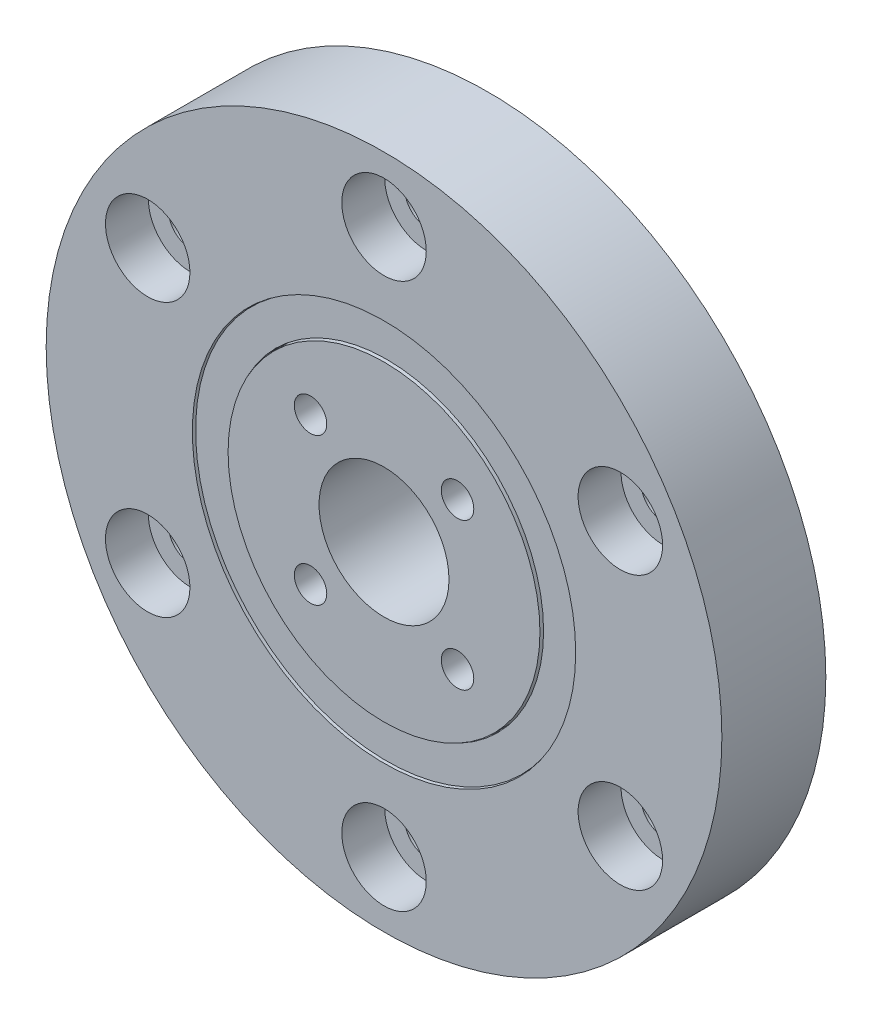
ISO-10303-21;
HEADER;
FILE_DESCRIPTION(('STEP AP214'),'2;1');
FILE_NAME('part.step','',(''),(''),'','','');
FILE_SCHEMA(('AUTOMOTIVE_DESIGN { 1 0 10303 214 1 1 1 1 }'));
ENDSEC;
DATA;
#1=APPLICATION_CONTEXT('core data for automotive mechanical design processes');
#2=APPLICATION_PROTOCOL_DEFINITION('international standard','automotive_design',2000,#1);
#3=PRODUCT_CONTEXT('',#1,'mechanical');
#4=PRODUCT('Part','Part','',(#3));
#5=PRODUCT_RELATED_PRODUCT_CATEGORY('part','',(#4));
#6=PRODUCT_DEFINITION_FORMATION('','',#4);
#7=PRODUCT_DEFINITION_CONTEXT('part definition',#1,'design');
#8=PRODUCT_DEFINITION('design','',#6,#7);
#9=PRODUCT_DEFINITION_SHAPE('','',#8);
#10=(LENGTH_UNIT() NAMED_UNIT(*) SI_UNIT(.MILLI.,.METRE.));
#11=(NAMED_UNIT(*) PLANE_ANGLE_UNIT() SI_UNIT($,.RADIAN.));
#12=(NAMED_UNIT(*) SI_UNIT($,.STERADIAN.) SOLID_ANGLE_UNIT());
#13=UNCERTAINTY_MEASURE_WITH_UNIT(LENGTH_MEASURE(1.E-05),#10,'distance_accuracy_value','');
#14=(GEOMETRIC_REPRESENTATION_CONTEXT(3) GLOBAL_UNCERTAINTY_ASSIGNED_CONTEXT((#13)) GLOBAL_UNIT_ASSIGNED_CONTEXT((#10,
#11,#12)) REPRESENTATION_CONTEXT('',''));
#15=CARTESIAN_POINT('',(0.,0.,0.));
#16=DIRECTION('',(0.,0.,1.));
#17=DIRECTION('',(1.,0.,0.));
#18=AXIS2_PLACEMENT_3D('',#15,#16,#17);
#19=CARTESIAN_POINT('',(0.,0.,0.75));
#20=DIRECTION('',(0.,0.,1.));
#21=DIRECTION('',(1.,0.,0.));
#22=AXIS2_PLACEMENT_3D('',#19,#20,#21);
#23=PLANE('',#22);
#24=CARTESIAN_POINT('',(0.,0.,0.75));
#25=DIRECTION('',(0.,0.,1.));
#26=DIRECTION('',(1.,0.,0.));
#27=AXIS2_PLACEMENT_3D('',#24,#25,#26);
#28=CIRCLE('',#27,14.7);
#29=CARTESIAN_POINT('',(14.7,0.,0.75));
#30=VERTEX_POINT('',#29);
#31=EDGE_CURVE('E11',#30,#30,#28,.T.);
#32=ORIENTED_EDGE('',*,*,#31,.T.);
#33=EDGE_LOOP('',(#32));
#34=FACE_BOUND('',#33,.T.);
#35=CARTESIAN_POINT('',(0.,0.,0.75));
#36=DIRECTION('',(0.,0.,1.));
#37=DIRECTION('',(1.,0.,0.));
#38=AXIS2_PLACEMENT_3D('',#35,#36,#37);
#39=CIRCLE('',#38,12.08);
#40=CARTESIAN_POINT('',(12.08,0.,0.75));
#41=VERTEX_POINT('',#40);
#42=EDGE_CURVE('E75',#41,#41,#39,.T.);
#43=ORIENTED_EDGE('',*,*,#42,.F.);
#44=EDGE_LOOP('',(#43));
#45=FACE_BOUND('',#44,.T.);
#46=ADVANCED_FACE('F58',(#34,#45),#23,.T.);
#47=CARTESIAN_POINT('',(0.,0.,0.2));
#48=DIRECTION('',(0.,0.,1.));
#49=DIRECTION('',(1.,0.,0.));
#50=AXIS2_PLACEMENT_3D('',#47,#48,#49);
#51=PLANE('',#50);
#52=CARTESIAN_POINT('',(0.,0.,0.2));
#53=DIRECTION('',(0.,0.,1.));
#54=DIRECTION('',(1.,0.,0.));
#55=AXIS2_PLACEMENT_3D('',#52,#53,#54);
#56=CIRCLE('',#55,14.7);
#57=CARTESIAN_POINT('',(14.7,0.,0.2));
#58=VERTEX_POINT('',#57);
#59=EDGE_CURVE('E62',#58,#58,#56,.T.);
#60=ORIENTED_EDGE('',*,*,#59,.F.);
#61=EDGE_LOOP('',(#60));
#62=FACE_BOUND('',#61,.T.);
#63=CARTESIAN_POINT('',(0.,0.,0.2));
#64=DIRECTION('',(0.,0.,1.));
#65=DIRECTION('',(1.,0.,0.));
#66=AXIS2_PLACEMENT_3D('',#63,#64,#65);
#67=CIRCLE('',#66,12.08);
#68=CARTESIAN_POINT('',(12.08,0.,0.2));
#69=VERTEX_POINT('',#68);
#70=EDGE_CURVE('E74',#69,#69,#67,.T.);
#71=ORIENTED_EDGE('',*,*,#70,.T.);
#72=EDGE_LOOP('',(#71));
#73=FACE_BOUND('',#72,.T.);
#74=ADVANCED_FACE('F83',(#62,#73),#51,.F.);
#75=CARTESIAN_POINT('',(0.,0.,0.75));
#76=DIRECTION('',(0.,0.,-1.));
#77=DIRECTION('',(-1.,0.,0.));
#78=AXIS2_PLACEMENT_3D('',#75,#76,#77);
#79=CYLINDRICAL_SURFACE('',#78,14.7);
#80=ORIENTED_EDGE('',*,*,#31,.F.);
#81=EDGE_LOOP('',(#80));
#82=FACE_BOUND('',#81,.T.);
#83=ORIENTED_EDGE('',*,*,#59,.T.);
#84=EDGE_LOOP('',(#83));
#85=FACE_BOUND('',#84,.T.);
#86=ADVANCED_FACE('F61',(#82,#85),#79,.T.);
#87=CARTESIAN_POINT('',(0.,0.,0.75));
#88=DIRECTION('',(0.,0.,-1.));
#89=DIRECTION('',(-1.,0.,0.));
#90=AXIS2_PLACEMENT_3D('',#87,#88,#89);
#91=CYLINDRICAL_SURFACE('',#90,12.08);
#92=ORIENTED_EDGE('',*,*,#42,.T.);
#93=EDGE_LOOP('',(#92));
#94=FACE_BOUND('',#93,.T.);
#95=ORIENTED_EDGE('',*,*,#70,.F.);
#96=EDGE_LOOP('',(#95));
#97=FACE_BOUND('',#96,.T.);
#98=ADVANCED_FACE('F77',(#94,#97),#91,.F.);
#99=CLOSED_SHELL('',(#46,#74,#86,#98));
#100=MANIFOLD_SOLID_BREP('B2',#99);
#101=CARTESIAN_POINT('',(0.,0.,7.8));
#102=DIRECTION('',(0.,0.,1.));
#103=DIRECTION('',(1.,0.,0.));
#104=AXIS2_PLACEMENT_3D('',#101,#102,#103);
#105=PLANE('',#104);
#106=CARTESIAN_POINT('',(0.,0.,7.8));
#107=DIRECTION('',(0.,0.,1.));
#108=DIRECTION('',(1.,0.,0.));
#109=AXIS2_PLACEMENT_3D('',#106,#107,#108);
#110=CIRCLE('',#109,14.7);
#111=CARTESIAN_POINT('',(14.7,0.,7.8));
#112=VERTEX_POINT('',#111);
#113=EDGE_CURVE('E56',#112,#112,#110,.T.);
#114=ORIENTED_EDGE('',*,*,#113,.T.);
#115=EDGE_LOOP('',(#114));
#116=FACE_BOUND('',#115,.T.);
#117=CARTESIAN_POINT('',(0.,0.,7.8));
#118=DIRECTION('',(0.,0.,1.));
#119=DIRECTION('',(1.,0.,0.));
#120=AXIS2_PLACEMENT_3D('',#117,#118,#119);
#121=CIRCLE('',#120,12.08);
#122=CARTESIAN_POINT('',(12.08,0.,7.8));
#123=VERTEX_POINT('',#122);
#124=EDGE_CURVE('E167',#123,#123,#121,.T.);
#125=ORIENTED_EDGE('',*,*,#124,.F.);
#126=EDGE_LOOP('',(#125));
#127=FACE_BOUND('',#126,.T.);
#128=ADVANCED_FACE('F152',(#116,#127),#105,.T.);
#129=CARTESIAN_POINT('',(0.,0.,7.25));
#130=DIRECTION('',(0.,0.,1.));
#131=DIRECTION('',(1.,0.,0.));
#132=AXIS2_PLACEMENT_3D('',#129,#130,#131);
#133=PLANE('',#132);
#134=CARTESIAN_POINT('',(0.,0.,7.25));
#135=DIRECTION('',(0.,0.,1.));
#136=DIRECTION('',(1.,0.,0.));
#137=AXIS2_PLACEMENT_3D('',#134,#135,#136);
#138=CIRCLE('',#137,14.7);
#139=CARTESIAN_POINT('',(14.7,0.,7.25));
#140=VERTEX_POINT('',#139);
#141=EDGE_CURVE('E157',#140,#140,#138,.T.);
#142=ORIENTED_EDGE('',*,*,#141,.F.);
#143=EDGE_LOOP('',(#142));
#144=FACE_BOUND('',#143,.T.);
#145=CARTESIAN_POINT('',(0.,0.,7.25));
#146=DIRECTION('',(0.,0.,1.));
#147=DIRECTION('',(1.,0.,0.));
#148=AXIS2_PLACEMENT_3D('',#145,#146,#147);
#149=CIRCLE('',#148,12.08);
#150=CARTESIAN_POINT('',(12.08,0.,7.25));
#151=VERTEX_POINT('',#150);
#152=EDGE_CURVE('E169',#151,#151,#149,.T.);
#153=ORIENTED_EDGE('',*,*,#152,.T.);
#154=EDGE_LOOP('',(#153));
#155=FACE_BOUND('',#154,.T.);
#156=ADVANCED_FACE('F180',(#144,#155),#133,.F.);
#157=CARTESIAN_POINT('',(0.,0.,7.8));
#158=DIRECTION('',(0.,0.,-1.));
#159=DIRECTION('',(-1.,0.,0.));
#160=AXIS2_PLACEMENT_3D('',#157,#158,#159);
#161=CYLINDRICAL_SURFACE('',#160,14.7);
#162=ORIENTED_EDGE('',*,*,#113,.F.);
#163=EDGE_LOOP('',(#162));
#164=FACE_BOUND('',#163,.T.);
#165=ORIENTED_EDGE('',*,*,#141,.T.);
#166=EDGE_LOOP('',(#165));
#167=FACE_BOUND('',#166,.T.);
#168=ADVANCED_FACE('F160',(#164,#167),#161,.T.);
#169=CARTESIAN_POINT('',(0.,0.,7.8));
#170=DIRECTION('',(0.,0.,-1.));
#171=DIRECTION('',(-1.,0.,0.));
#172=AXIS2_PLACEMENT_3D('',#169,#170,#171);
#173=CYLINDRICAL_SURFACE('',#172,12.08);
#174=ORIENTED_EDGE('',*,*,#124,.T.);
#175=EDGE_LOOP('',(#174));
#176=FACE_BOUND('',#175,.T.);
#177=ORIENTED_EDGE('',*,*,#152,.F.);
#178=EDGE_LOOP('',(#177));
#179=FACE_BOUND('',#178,.T.);
#180=ADVANCED_FACE('F174',(#176,#179),#173,.F.);
#181=CLOSED_SHELL('',(#128,#156,#168,#180));
#182=MANIFOLD_SOLID_BREP('B6',#181);
#183=CARTESIAN_POINT('',(0.,0.,8.));
#184=DIRECTION('',(0.,0.,1.));
#185=DIRECTION('',(1.,0.,0.));
#186=AXIS2_PLACEMENT_3D('',#183,#184,#185);
#187=PLANE('',#186);
#188=CARTESIAN_POINT('',(5.65685424949238,-5.65685424949238,8.));
#189=DIRECTION('',(0.,0.,1.));
#190=DIRECTION('',(1.,0.,0.));
#191=AXIS2_PLACEMENT_3D('',#188,#189,#190);
#192=CIRCLE('',#191,1.24999999999999);
#193=CARTESIAN_POINT('',(6.90685424949237,-5.65685424949238,8.));
#194=VERTEX_POINT('',#193);
#195=EDGE_CURVE('E286',#194,#194,#192,.T.);
#196=ORIENTED_EDGE('',*,*,#195,.F.);
#197=EDGE_LOOP('',(#196));
#198=FACE_BOUND('',#197,.T.);
#199=CARTESIAN_POINT('',(-5.65685424949238,-5.65685424949238,8.));
#200=DIRECTION('',(0.,0.,1.));
#201=DIRECTION('',(1.,0.,0.));
#202=AXIS2_PLACEMENT_3D('',#199,#200,#201);
#203=CIRCLE('',#202,1.24999999999999);
#204=CARTESIAN_POINT('',(-4.40685424949239,-5.65685424949238,8.));
#205=VERTEX_POINT('',#204);
#206=EDGE_CURVE('E283',#205,#205,#203,.T.);
#207=ORIENTED_EDGE('',*,*,#206,.F.);
#208=EDGE_LOOP('',(#207));
#209=FACE_BOUND('',#208,.T.);
#210=CARTESIAN_POINT('',(-5.65685424949238,5.65685424949238,8.));
#211=DIRECTION('',(0.,0.,1.));
#212=DIRECTION('',(1.,0.,0.));
#213=AXIS2_PLACEMENT_3D('',#210,#211,#212);
#214=CIRCLE('',#213,1.24999999999999);
#215=CARTESIAN_POINT('',(-4.40685424949239,5.65685424949238,8.));
#216=VERTEX_POINT('',#215);
#217=EDGE_CURVE('E274',#216,#216,#214,.T.);
#218=ORIENTED_EDGE('',*,*,#217,.F.);
#219=EDGE_LOOP('',(#218));
#220=FACE_BOUND('',#219,.T.);
#221=CARTESIAN_POINT('',(5.65685424949238,5.65685424949238,8.));
#222=DIRECTION('',(0.,0.,1.));
#223=DIRECTION('',(1.,0.,0.));
#224=AXIS2_PLACEMENT_3D('',#221,#222,#223);
#225=CIRCLE('',#224,1.24999999999999);
#226=CARTESIAN_POINT('',(6.90685424949237,5.65685424949238,8.));
#227=VERTEX_POINT('',#226);
#228=EDGE_CURVE('E267',#227,#227,#225,.T.);
#229=ORIENTED_EDGE('',*,*,#228,.F.);
#230=EDGE_LOOP('',(#229));
#231=FACE_BOUND('',#230,.T.);
#232=CARTESIAN_POINT('',(0.,0.,8.));
#233=DIRECTION('',(0.,0.,1.));
#234=DIRECTION('',(1.,0.,0.));
#235=AXIS2_PLACEMENT_3D('',#232,#233,#234);
#236=CIRCLE('',#235,12.);
#237=CARTESIAN_POINT('',(12.,0.,8.));
#238=VERTEX_POINT('',#237);
#239=EDGE_CURVE('E153',#238,#238,#236,.T.);
#240=ORIENTED_EDGE('',*,*,#239,.T.);
#241=EDGE_LOOP('',(#240));
#242=FACE_BOUND('',#241,.T.);
#243=CARTESIAN_POINT('',(0.,0.,8.));
#244=DIRECTION('',(0.,0.,1.));
#245=DIRECTION('',(1.,0.,0.));
#246=AXIS2_PLACEMENT_3D('',#243,#244,#245);
#247=CIRCLE('',#246,5.);
#248=CARTESIAN_POINT('',(5.,0.,8.));
#249=VERTEX_POINT('',#248);
#250=EDGE_CURVE('E259',#249,#249,#247,.T.);
#251=ORIENTED_EDGE('',*,*,#250,.F.);
#252=EDGE_LOOP('',(#251));
#253=FACE_BOUND('',#252,.T.);
#254=ADVANCED_FACE('F246',(#198,#209,#220,#231,#242,#253),#187,.T.);
#255=CARTESIAN_POINT('',(0.,0.,0.));
#256=DIRECTION('',(0.,0.,1.));
#257=DIRECTION('',(1.,0.,0.));
#258=AXIS2_PLACEMENT_3D('',#255,#256,#257);
#259=PLANE('',#258);
#260=CARTESIAN_POINT('',(5.65685424949238,-5.65685424949238,0.));
#261=DIRECTION('',(0.,0.,1.));
#262=DIRECTION('',(1.,0.,0.));
#263=AXIS2_PLACEMENT_3D('',#260,#261,#262);
#264=CIRCLE('',#263,1.24999999999999);
#265=CARTESIAN_POINT('',(6.90685424949237,-5.65685424949238,0.));
#266=VERTEX_POINT('',#265);
#267=EDGE_CURVE('E284',#266,#266,#264,.T.);
#268=ORIENTED_EDGE('',*,*,#267,.T.);
#269=EDGE_LOOP('',(#268));
#270=FACE_BOUND('',#269,.T.);
#271=CARTESIAN_POINT('',(-5.65685424949238,-5.65685424949238,0.));
#272=DIRECTION('',(0.,0.,1.));
#273=DIRECTION('',(1.,0.,0.));
#274=AXIS2_PLACEMENT_3D('',#271,#272,#273);
#275=CIRCLE('',#274,1.24999999999999);
#276=CARTESIAN_POINT('',(-4.4068542494924,-5.65685424949238,0.));
#277=VERTEX_POINT('',#276);
#278=EDGE_CURVE('E279',#277,#277,#275,.T.);
#279=ORIENTED_EDGE('',*,*,#278,.T.);
#280=EDGE_LOOP('',(#279));
#281=FACE_BOUND('',#280,.T.);
#282=CARTESIAN_POINT('',(-5.65685424949238,5.65685424949238,0.));
#283=DIRECTION('',(0.,0.,1.));
#284=DIRECTION('',(1.,0.,0.));
#285=AXIS2_PLACEMENT_3D('',#282,#283,#284);
#286=CIRCLE('',#285,1.24999999999999);
#287=CARTESIAN_POINT('',(-4.40685424949239,5.65685424949238,0.));
#288=VERTEX_POINT('',#287);
#289=EDGE_CURVE('E275',#288,#288,#286,.T.);
#290=ORIENTED_EDGE('',*,*,#289,.T.);
#291=EDGE_LOOP('',(#290));
#292=FACE_BOUND('',#291,.T.);
#293=CARTESIAN_POINT('',(5.65685424949238,5.65685424949238,0.));
#294=DIRECTION('',(0.,0.,1.));
#295=DIRECTION('',(1.,0.,0.));
#296=AXIS2_PLACEMENT_3D('',#293,#294,#295);
#297=CIRCLE('',#296,1.24999999999999);
#298=CARTESIAN_POINT('',(6.90685424949237,5.65685424949238,0.));
#299=VERTEX_POINT('',#298);
#300=EDGE_CURVE('E262',#299,#299,#297,.T.);
#301=ORIENTED_EDGE('',*,*,#300,.T.);
#302=EDGE_LOOP('',(#301));
#303=FACE_BOUND('',#302,.T.);
#304=CARTESIAN_POINT('',(0.,0.,0.));
#305=DIRECTION('',(0.,0.,1.));
#306=DIRECTION('',(1.,0.,0.));
#307=AXIS2_PLACEMENT_3D('',#304,#305,#306);
#308=CIRCLE('',#307,12.);
#309=CARTESIAN_POINT('',(12.,0.,0.));
#310=VERTEX_POINT('',#309);
#311=EDGE_CURVE('E252',#310,#310,#308,.T.);
#312=ORIENTED_EDGE('',*,*,#311,.F.);
#313=EDGE_LOOP('',(#312));
#314=FACE_BOUND('',#313,.T.);
#315=CARTESIAN_POINT('',(0.,0.,0.));
#316=DIRECTION('',(0.,0.,1.));
#317=DIRECTION('',(1.,0.,0.));
#318=AXIS2_PLACEMENT_3D('',#315,#316,#317);
#319=CIRCLE('',#318,5.);
#320=CARTESIAN_POINT('',(5.,0.,0.));
#321=VERTEX_POINT('',#320);
#322=EDGE_CURVE('E261',#321,#321,#319,.T.);
#323=ORIENTED_EDGE('',*,*,#322,.T.);
#324=EDGE_LOOP('',(#323));
#325=FACE_BOUND('',#324,.T.);
#326=ADVANCED_FACE('F293',(#270,#281,#292,#303,#314,#325),#259,.F.);
#327=CARTESIAN_POINT('',(0.,0.,8.));
#328=DIRECTION('',(0.,0.,-1.));
#329=DIRECTION('',(-1.,0.,0.));
#330=AXIS2_PLACEMENT_3D('',#327,#328,#329);
#331=CYLINDRICAL_SURFACE('',#330,12.);
#332=ORIENTED_EDGE('',*,*,#239,.F.);
#333=EDGE_LOOP('',(#332));
#334=FACE_BOUND('',#333,.T.);
#335=ORIENTED_EDGE('',*,*,#311,.T.);
#336=EDGE_LOOP('',(#335));
#337=FACE_BOUND('',#336,.T.);
#338=ADVANCED_FACE('F247',(#334,#337),#331,.T.);
#339=CARTESIAN_POINT('',(0.,0.,8.));
#340=DIRECTION('',(0.,0.,-1.));
#341=DIRECTION('',(-1.,0.,0.));
#342=AXIS2_PLACEMENT_3D('',#339,#340,#341);
#343=CYLINDRICAL_SURFACE('',#342,5.);
#344=ORIENTED_EDGE('',*,*,#250,.T.);
#345=EDGE_LOOP('',(#344));
#346=FACE_BOUND('',#345,.T.);
#347=ORIENTED_EDGE('',*,*,#322,.F.);
#348=EDGE_LOOP('',(#347));
#349=FACE_BOUND('',#348,.T.);
#350=ADVANCED_FACE('F302',(#346,#349),#343,.F.);
#351=CARTESIAN_POINT('',(5.65685424949238,5.65685424949238,8.));
#352=DIRECTION('',(0.,0.,1.));
#353=DIRECTION('',(1.,0.,0.));
#354=AXIS2_PLACEMENT_3D('',#351,#352,#353);
#355=CYLINDRICAL_SURFACE('',#354,1.24999999999999);
#356=ORIENTED_EDGE('',*,*,#300,.F.);
#357=EDGE_LOOP('',(#356));
#358=FACE_BOUND('',#357,.T.);
#359=ORIENTED_EDGE('',*,*,#228,.T.);
#360=EDGE_LOOP('',(#359));
#361=FACE_BOUND('',#360,.T.);
#362=ADVANCED_FACE('F306',(#358,#361),#355,.F.);
#363=CARTESIAN_POINT('',(-5.65685424949238,5.65685424949238,8.));
#364=DIRECTION('',(0.,0.,1.));
#365=DIRECTION('',(1.,0.,0.));
#366=AXIS2_PLACEMENT_3D('',#363,#364,#365);
#367=CYLINDRICAL_SURFACE('',#366,1.24999999999999);
#368=ORIENTED_EDGE('',*,*,#289,.F.);
#369=EDGE_LOOP('',(#368));
#370=FACE_BOUND('',#369,.T.);
#371=ORIENTED_EDGE('',*,*,#217,.T.);
#372=EDGE_LOOP('',(#371));
#373=FACE_BOUND('',#372,.T.);
#374=ADVANCED_FACE('F330',(#370,#373),#367,.F.);
#375=CARTESIAN_POINT('',(-5.65685424949238,-5.65685424949238,8.));
#376=DIRECTION('',(0.,0.,1.));
#377=DIRECTION('',(1.,0.,0.));
#378=AXIS2_PLACEMENT_3D('',#375,#376,#377);
#379=CYLINDRICAL_SURFACE('',#378,1.24999999999999);
#380=ORIENTED_EDGE('',*,*,#278,.F.);
#381=EDGE_LOOP('',(#380));
#382=FACE_BOUND('',#381,.T.);
#383=ORIENTED_EDGE('',*,*,#206,.T.);
#384=EDGE_LOOP('',(#383));
#385=FACE_BOUND('',#384,.T.);
#386=ADVANCED_FACE('F335',(#382,#385),#379,.F.);
#387=CARTESIAN_POINT('',(5.65685424949238,-5.65685424949238,8.));
#388=DIRECTION('',(0.,0.,1.));
#389=DIRECTION('',(1.,0.,0.));
#390=AXIS2_PLACEMENT_3D('',#387,#388,#389);
#391=CYLINDRICAL_SURFACE('',#390,1.24999999999999);
#392=ORIENTED_EDGE('',*,*,#267,.F.);
#393=EDGE_LOOP('',(#392));
#394=FACE_BOUND('',#393,.T.);
#395=ORIENTED_EDGE('',*,*,#195,.T.);
#396=EDGE_LOOP('',(#395));
#397=FACE_BOUND('',#396,.T.);
#398=ADVANCED_FACE('F292',(#394,#397),#391,.F.);
#399=CLOSED_SHELL('',(#254,#326,#338,#350,#362,#374,#386,#398));
#400=MANIFOLD_SOLID_BREP('B53',#399);
#401=CARTESIAN_POINT('',(0.,0.,8.));
#402=DIRECTION('',(0.,0.,1.));
#403=DIRECTION('',(1.,0.,0.));
#404=AXIS2_PLACEMENT_3D('',#401,#402,#403);
#405=PLANE('',#404);
#406=CARTESIAN_POINT('',(18.1865334794732,10.5,8.));
#407=DIRECTION('',(0.,0.,1.));
#408=DIRECTION('',(1.,0.,0.));
#409=AXIS2_PLACEMENT_3D('',#406,#407,#408);
#410=CIRCLE('',#409,3.25);
#411=CARTESIAN_POINT('',(21.4365334794732,10.5,8.));
#412=VERTEX_POINT('',#411);
#413=EDGE_CURVE('E524',#412,#412,#410,.T.);
#414=ORIENTED_EDGE('',*,*,#413,.F.);
#415=EDGE_LOOP('',(#414));
#416=FACE_BOUND('',#415,.T.);
#417=CARTESIAN_POINT('',(18.1865334794732,-10.5,8.));
#418=DIRECTION('',(0.,0.,1.));
#419=DIRECTION('',(1.,0.,0.));
#420=AXIS2_PLACEMENT_3D('',#417,#418,#419);
#421=CIRCLE('',#420,3.25);
#422=CARTESIAN_POINT('',(21.4365334794732,-10.5,8.));
#423=VERTEX_POINT('',#422);
#424=EDGE_CURVE('E508',#423,#423,#421,.T.);
#425=ORIENTED_EDGE('',*,*,#424,.F.);
#426=EDGE_LOOP('',(#425));
#427=FACE_BOUND('',#426,.T.);
#428=CARTESIAN_POINT('',(0.,-21.,8.));
#429=DIRECTION('',(0.,0.,1.));
#430=DIRECTION('',(1.,0.,0.));
#431=AXIS2_PLACEMENT_3D('',#428,#429,#430);
#432=CIRCLE('',#431,3.25);
#433=CARTESIAN_POINT('',(3.24999999999999,-21.,8.));
#434=VERTEX_POINT('',#433);
#435=EDGE_CURVE('E500',#434,#434,#432,.T.);
#436=ORIENTED_EDGE('',*,*,#435,.F.);
#437=EDGE_LOOP('',(#436));
#438=FACE_BOUND('',#437,.T.);
#439=CARTESIAN_POINT('',(-18.1865334794732,-10.5,8.));
#440=DIRECTION('',(0.,0.,1.));
#441=DIRECTION('',(1.,0.,0.));
#442=AXIS2_PLACEMENT_3D('',#439,#440,#441);
#443=CIRCLE('',#442,3.25);
#444=CARTESIAN_POINT('',(-14.9365334794732,-10.5,8.));
#445=VERTEX_POINT('',#444);
#446=EDGE_CURVE('E484',#445,#445,#443,.T.);
#447=ORIENTED_EDGE('',*,*,#446,.F.);
#448=EDGE_LOOP('',(#447));
#449=FACE_BOUND('',#448,.T.);
#450=CARTESIAN_POINT('',(-18.1865334794732,10.5,8.));
#451=DIRECTION('',(0.,0.,1.));
#452=DIRECTION('',(1.,0.,0.));
#453=AXIS2_PLACEMENT_3D('',#450,#451,#452);
#454=CIRCLE('',#453,3.25);
#455=CARTESIAN_POINT('',(-14.9365334794732,10.5,8.));
#456=VERTEX_POINT('',#455);
#457=EDGE_CURVE('E471',#456,#456,#454,.T.);
#458=ORIENTED_EDGE('',*,*,#457,.F.);
#459=EDGE_LOOP('',(#458));
#460=FACE_BOUND('',#459,.T.);
#461=CARTESIAN_POINT('',(0.,21.,8.));
#462=DIRECTION('',(0.,0.,1.));
#463=DIRECTION('',(1.,0.,0.));
#464=AXIS2_PLACEMENT_3D('',#461,#462,#463);
#465=CIRCLE('',#464,3.25);
#466=CARTESIAN_POINT('',(3.25,21.,8.));
#467=VERTEX_POINT('',#466);
#468=EDGE_CURVE('E463',#467,#467,#465,.T.);
#469=ORIENTED_EDGE('',*,*,#468,.F.);
#470=EDGE_LOOP('',(#469));
#471=FACE_BOUND('',#470,.T.);
#472=CARTESIAN_POINT('',(0.,0.,8.));
#473=DIRECTION('',(0.,0.,1.));
#474=DIRECTION('',(1.,0.,0.));
#475=AXIS2_PLACEMENT_3D('',#472,#473,#474);
#476=CIRCLE('',#475,26.);
#477=CARTESIAN_POINT('',(26.,0.,8.));
#478=VERTEX_POINT('',#477);
#479=EDGE_CURVE('E249',#478,#478,#476,.T.);
#480=ORIENTED_EDGE('',*,*,#479,.T.);
#481=EDGE_LOOP('',(#480));
#482=FACE_BOUND('',#481,.T.);
#483=CARTESIAN_POINT('',(0.,0.,8.));
#484=DIRECTION('',(0.,0.,1.));
#485=DIRECTION('',(1.,0.,0.));
#486=AXIS2_PLACEMENT_3D('',#483,#484,#485);
#487=CIRCLE('',#486,14.75);
#488=CARTESIAN_POINT('',(14.75,0.,8.));
#489=VERTEX_POINT('',#488);
#490=EDGE_CURVE('E443',#489,#489,#487,.T.);
#491=ORIENTED_EDGE('',*,*,#490,.F.);
#492=EDGE_LOOP('',(#491));
#493=FACE_BOUND('',#492,.T.);
#494=ADVANCED_FACE('F433',(#416,#427,#438,#449,#460,#471,#482,#493),#405,.T.);
#495=CARTESIAN_POINT('',(0.,0.,0.));
#496=DIRECTION('',(0.,0.,1.));
#497=DIRECTION('',(1.,0.,0.));
#498=AXIS2_PLACEMENT_3D('',#495,#496,#497);
#499=PLANE('',#498);
#500=CARTESIAN_POINT('',(18.1865334794732,10.5,0.));
#501=DIRECTION('',(0.,0.,1.));
#502=DIRECTION('',(1.,0.,0.));
#503=AXIS2_PLACEMENT_3D('',#500,#501,#502);
#504=CIRCLE('',#503,1.70000000000001);
#505=CARTESIAN_POINT('',(19.8865334794732,10.5,0.));
#506=VERTEX_POINT('',#505);
#507=EDGE_CURVE('E515',#506,#506,#504,.T.);
#508=ORIENTED_EDGE('',*,*,#507,.T.);
#509=EDGE_LOOP('',(#508));
#510=FACE_BOUND('',#509,.T.);
#511=CARTESIAN_POINT('',(18.1865334794732,-10.5,0.));
#512=DIRECTION('',(0.,0.,1.));
#513=DIRECTION('',(1.,0.,0.));
#514=AXIS2_PLACEMENT_3D('',#511,#512,#513);
#515=CIRCLE('',#514,1.70000000000001);
#516=CARTESIAN_POINT('',(19.8865334794732,-10.5,0.));
#517=VERTEX_POINT('',#516);
#518=EDGE_CURVE('E498',#517,#517,#515,.T.);
#519=ORIENTED_EDGE('',*,*,#518,.T.);
#520=EDGE_LOOP('',(#519));
#521=FACE_BOUND('',#520,.T.);
#522=CARTESIAN_POINT('',(0.,-21.,0.));
#523=DIRECTION('',(0.,0.,1.));
#524=DIRECTION('',(1.,0.,0.));
#525=AXIS2_PLACEMENT_3D('',#522,#523,#524);
#526=CIRCLE('',#525,1.70000000000001);
#527=CARTESIAN_POINT('',(1.70000000000001,-21.,0.));
#528=VERTEX_POINT('',#527);
#529=EDGE_CURVE('E488',#528,#528,#526,.T.);
#530=ORIENTED_EDGE('',*,*,#529,.T.);
#531=EDGE_LOOP('',(#530));
#532=FACE_BOUND('',#531,.T.);
#533=CARTESIAN_POINT('',(-18.1865334794732,-10.5,0.));
#534=DIRECTION('',(0.,0.,1.));
#535=DIRECTION('',(1.,0.,0.));
#536=AXIS2_PLACEMENT_3D('',#533,#534,#535);
#537=CIRCLE('',#536,1.70000000000001);
#538=CARTESIAN_POINT('',(-16.4865334794732,-10.5,0.));
#539=VERTEX_POINT('',#538);
#540=EDGE_CURVE('E478',#539,#539,#537,.T.);
#541=ORIENTED_EDGE('',*,*,#540,.T.);
#542=EDGE_LOOP('',(#541));
#543=FACE_BOUND('',#542,.T.);
#544=CARTESIAN_POINT('',(-18.1865334794732,10.5,0.));
#545=DIRECTION('',(0.,0.,1.));
#546=DIRECTION('',(1.,0.,0.));
#547=AXIS2_PLACEMENT_3D('',#544,#545,#546);
#548=CIRCLE('',#547,1.70000000000001);
#549=CARTESIAN_POINT('',(-16.4865334794732,10.5,0.));
#550=VERTEX_POINT('',#549);
#551=EDGE_CURVE('E464',#550,#550,#548,.T.);
#552=ORIENTED_EDGE('',*,*,#551,.T.);
#553=EDGE_LOOP('',(#552));
#554=FACE_BOUND('',#553,.T.);
#555=CARTESIAN_POINT('',(0.,21.,0.));
#556=DIRECTION('',(0.,0.,1.));
#557=DIRECTION('',(1.,0.,0.));
#558=AXIS2_PLACEMENT_3D('',#555,#556,#557);
#559=CIRCLE('',#558,1.70000000000001);
#560=CARTESIAN_POINT('',(1.70000000000001,21.,0.));
#561=VERTEX_POINT('',#560);
#562=EDGE_CURVE('E447',#561,#561,#559,.T.);
#563=ORIENTED_EDGE('',*,*,#562,.T.);
#564=EDGE_LOOP('',(#563));
#565=FACE_BOUND('',#564,.T.);
#566=CARTESIAN_POINT('',(0.,0.,0.));
#567=DIRECTION('',(0.,0.,1.));
#568=DIRECTION('',(1.,0.,0.));
#569=AXIS2_PLACEMENT_3D('',#566,#567,#568);
#570=CIRCLE('',#569,26.);
#571=CARTESIAN_POINT('',(26.,0.,0.));
#572=VERTEX_POINT('',#571);
#573=EDGE_CURVE('E437',#572,#572,#570,.T.);
#574=ORIENTED_EDGE('',*,*,#573,.F.);
#575=EDGE_LOOP('',(#574));
#576=FACE_BOUND('',#575,.T.);
#577=CARTESIAN_POINT('',(0.,0.,0.));
#578=DIRECTION('',(0.,0.,1.));
#579=DIRECTION('',(1.,0.,0.));
#580=AXIS2_PLACEMENT_3D('',#577,#578,#579);
#581=CIRCLE('',#580,14.75);
#582=CARTESIAN_POINT('',(14.75,0.,0.));
#583=VERTEX_POINT('',#582);
#584=EDGE_CURVE('E450',#583,#583,#581,.T.);
#585=ORIENTED_EDGE('',*,*,#584,.T.);
#586=EDGE_LOOP('',(#585));
#587=FACE_BOUND('',#586,.T.);
#588=ADVANCED_FACE('F530',(#510,#521,#532,#543,#554,#565,#576,#587),#499,.F.);
#589=CARTESIAN_POINT('',(0.,0.,8.));
#590=DIRECTION('',(0.,0.,-1.));
#591=DIRECTION('',(-1.,0.,0.));
#592=AXIS2_PLACEMENT_3D('',#589,#590,#591);
#593=CYLINDRICAL_SURFACE('',#592,26.);
#594=ORIENTED_EDGE('',*,*,#479,.F.);
#595=EDGE_LOOP('',(#594));
#596=FACE_BOUND('',#595,.T.);
#597=ORIENTED_EDGE('',*,*,#573,.T.);
#598=EDGE_LOOP('',(#597));
#599=FACE_BOUND('',#598,.T.);
#600=ADVANCED_FACE('F436',(#596,#599),#593,.T.);
#601=CARTESIAN_POINT('',(0.,0.,8.));
#602=DIRECTION('',(0.,0.,-1.));
#603=DIRECTION('',(-1.,0.,0.));
#604=AXIS2_PLACEMENT_3D('',#601,#602,#603);
#605=CYLINDRICAL_SURFACE('',#604,14.75);
#606=ORIENTED_EDGE('',*,*,#490,.T.);
#607=EDGE_LOOP('',(#606));
#608=FACE_BOUND('',#607,.T.);
#609=ORIENTED_EDGE('',*,*,#584,.F.);
#610=EDGE_LOOP('',(#609));
#611=FACE_BOUND('',#610,.T.);
#612=ADVANCED_FACE('F543',(#608,#611),#605,.F.);
#613=CARTESIAN_POINT('',(0.,21.,8.));
#614=DIRECTION('',(0.,0.,1.));
#615=DIRECTION('',(1.,0.,0.));
#616=AXIS2_PLACEMENT_3D('',#613,#614,#615);
#617=CYLINDRICAL_SURFACE('',#616,1.70000000000001);
#618=ORIENTED_EDGE('',*,*,#562,.F.);
#619=EDGE_LOOP('',(#618));
#620=FACE_BOUND('',#619,.T.);
#621=CARTESIAN_POINT('',(0.,21.,4.7));
#622=DIRECTION('',(0.,0.,1.));
#623=DIRECTION('',(1.,0.,0.));
#624=AXIS2_PLACEMENT_3D('',#621,#622,#623);
#625=CIRCLE('',#624,1.70000000000001);
#626=CARTESIAN_POINT('',(1.70000000000001,21.,4.7));
#627=VERTEX_POINT('',#626);
#628=EDGE_CURVE('E452',#627,#627,#625,.T.);
#629=ORIENTED_EDGE('',*,*,#628,.T.);
#630=EDGE_LOOP('',(#629));
#631=FACE_BOUND('',#630,.T.);
#632=ADVANCED_FACE('F546',(#620,#631),#617,.F.);
#633=CARTESIAN_POINT('',(1.70000000000001,21.,4.7));
#634=DIRECTION('',(0.,0.,-1.));
#635=DIRECTION('',(-1.,0.,0.));
#636=AXIS2_PLACEMENT_3D('',#633,#634,#635);
#637=PLANE('',#636);
#638=ORIENTED_EDGE('',*,*,#628,.F.);
#639=EDGE_LOOP('',(#638));
#640=FACE_BOUND('',#639,.T.);
#641=CARTESIAN_POINT('',(0.,21.,4.7));
#642=DIRECTION('',(0.,0.,1.));
#643=DIRECTION('',(1.,0.,0.));
#644=AXIS2_PLACEMENT_3D('',#641,#642,#643);
#645=CIRCLE('',#644,3.25);
#646=CARTESIAN_POINT('',(3.25,21.,4.7));
#647=VERTEX_POINT('',#646);
#648=EDGE_CURVE('E456',#647,#647,#645,.T.);
#649=ORIENTED_EDGE('',*,*,#648,.T.);
#650=EDGE_LOOP('',(#649));
#651=FACE_BOUND('',#650,.T.);
#652=ADVANCED_FACE('F562',(#640,#651),#637,.F.);
#653=CARTESIAN_POINT('',(0.,21.,8.));
#654=DIRECTION('',(0.,0.,1.));
#655=DIRECTION('',(1.,0.,0.));
#656=AXIS2_PLACEMENT_3D('',#653,#654,#655);
#657=CYLINDRICAL_SURFACE('',#656,3.25);
#658=ORIENTED_EDGE('',*,*,#648,.F.);
#659=EDGE_LOOP('',(#658));
#660=FACE_BOUND('',#659,.T.);
#661=ORIENTED_EDGE('',*,*,#468,.T.);
#662=EDGE_LOOP('',(#661));
#663=FACE_BOUND('',#662,.T.);
#664=ADVANCED_FACE('F568',(#660,#663),#657,.F.);
#665=CARTESIAN_POINT('',(-18.1865334794732,10.5,8.));
#666=DIRECTION('',(0.,0.,1.));
#667=DIRECTION('',(1.,0.,0.));
#668=AXIS2_PLACEMENT_3D('',#665,#666,#667);
#669=CYLINDRICAL_SURFACE('',#668,1.70000000000001);
#670=ORIENTED_EDGE('',*,*,#551,.F.);
#671=EDGE_LOOP('',(#670));
#672=FACE_BOUND('',#671,.T.);
#673=CARTESIAN_POINT('',(-18.1865334794732,10.5,4.7));
#674=DIRECTION('',(0.,0.,1.));
#675=DIRECTION('',(1.,0.,0.));
#676=AXIS2_PLACEMENT_3D('',#673,#674,#675);
#677=CIRCLE('',#676,1.70000000000001);
#678=CARTESIAN_POINT('',(-16.4865334794732,10.5,4.7));
#679=VERTEX_POINT('',#678);
#680=EDGE_CURVE('E466',#679,#679,#677,.T.);
#681=ORIENTED_EDGE('',*,*,#680,.T.);
#682=EDGE_LOOP('',(#681));
#683=FACE_BOUND('',#682,.T.);
#684=ADVANCED_FACE('F572',(#672,#683),#669,.F.);
#685=CARTESIAN_POINT('',(-16.4865334794732,10.5,4.7));
#686=DIRECTION('',(0.,0.,-1.));
#687=DIRECTION('',(-1.,0.,0.));
#688=AXIS2_PLACEMENT_3D('',#685,#686,#687);
#689=PLANE('',#688);
#690=ORIENTED_EDGE('',*,*,#680,.F.);
#691=EDGE_LOOP('',(#690));
#692=FACE_BOUND('',#691,.T.);
#693=CARTESIAN_POINT('',(-18.1865334794732,10.5,4.7));
#694=DIRECTION('',(0.,0.,1.));
#695=DIRECTION('',(1.,0.,0.));
#696=AXIS2_PLACEMENT_3D('',#693,#694,#695);
#697=CIRCLE('',#696,3.25);
#698=CARTESIAN_POINT('',(-14.9365334794732,10.5,4.7));
#699=VERTEX_POINT('',#698);
#700=EDGE_CURVE('E467',#699,#699,#697,.T.);
#701=ORIENTED_EDGE('',*,*,#700,.T.);
#702=EDGE_LOOP('',(#701));
#703=FACE_BOUND('',#702,.T.);
#704=ADVANCED_FACE('F577',(#692,#703),#689,.F.);
#705=CARTESIAN_POINT('',(-18.1865334794732,10.5,8.));
#706=DIRECTION('',(0.,0.,1.));
#707=DIRECTION('',(1.,0.,0.));
#708=AXIS2_PLACEMENT_3D('',#705,#706,#707);
#709=CYLINDRICAL_SURFACE('',#708,3.25);
#710=ORIENTED_EDGE('',*,*,#700,.F.);
#711=EDGE_LOOP('',(#710));
#712=FACE_BOUND('',#711,.T.);
#713=ORIENTED_EDGE('',*,*,#457,.T.);
#714=EDGE_LOOP('',(#713));
#715=FACE_BOUND('',#714,.T.);
#716=ADVANCED_FACE('F584',(#712,#715),#709,.F.);
#717=CARTESIAN_POINT('',(-18.1865334794732,-10.5,8.));
#718=DIRECTION('',(0.,0.,1.));
#719=DIRECTION('',(1.,0.,0.));
#720=AXIS2_PLACEMENT_3D('',#717,#718,#719);
#721=CYLINDRICAL_SURFACE('',#720,1.70000000000001);
#722=ORIENTED_EDGE('',*,*,#540,.F.);
#723=EDGE_LOOP('',(#722));
#724=FACE_BOUND('',#723,.T.);
#725=CARTESIAN_POINT('',(-18.1865334794732,-10.5,4.7));
#726=DIRECTION('',(0.,0.,1.));
#727=DIRECTION('',(1.,0.,0.));
#728=AXIS2_PLACEMENT_3D('',#725,#726,#727);
#729=CIRCLE('',#728,1.70000000000001);
#730=CARTESIAN_POINT('',(-16.4865334794732,-10.5,4.7));
#731=VERTEX_POINT('',#730);
#732=EDGE_CURVE('E479',#731,#731,#729,.T.);
#733=ORIENTED_EDGE('',*,*,#732,.T.);
#734=EDGE_LOOP('',(#733));
#735=FACE_BOUND('',#734,.T.);
#736=ADVANCED_FACE('F587',(#724,#735),#721,.F.);
#737=CARTESIAN_POINT('',(-16.4865334794732,-10.5,4.7));
#738=DIRECTION('',(0.,0.,-1.));
#739=DIRECTION('',(-1.,0.,0.));
#740=AXIS2_PLACEMENT_3D('',#737,#738,#739);
#741=PLANE('',#740);
#742=ORIENTED_EDGE('',*,*,#732,.F.);
#743=EDGE_LOOP('',(#742));
#744=FACE_BOUND('',#743,.T.);
#745=CARTESIAN_POINT('',(-18.1865334794732,-10.5,4.7));
#746=DIRECTION('',(0.,0.,1.));
#747=DIRECTION('',(1.,0.,0.));
#748=AXIS2_PLACEMENT_3D('',#745,#746,#747);
#749=CIRCLE('',#748,3.25);
#750=CARTESIAN_POINT('',(-14.9365334794732,-10.5,4.7));
#751=VERTEX_POINT('',#750);
#752=EDGE_CURVE('E485',#751,#751,#749,.T.);
#753=ORIENTED_EDGE('',*,*,#752,.T.);
#754=EDGE_LOOP('',(#753));
#755=FACE_BOUND('',#754,.T.);
#756=ADVANCED_FACE('F594',(#744,#755),#741,.F.);
#757=CARTESIAN_POINT('',(-18.1865334794732,-10.5,8.));
#758=DIRECTION('',(0.,0.,1.));
#759=DIRECTION('',(1.,0.,0.));
#760=AXIS2_PLACEMENT_3D('',#757,#758,#759);
#761=CYLINDRICAL_SURFACE('',#760,3.25);
#762=ORIENTED_EDGE('',*,*,#752,.F.);
#763=EDGE_LOOP('',(#762));
#764=FACE_BOUND('',#763,.T.);
#765=ORIENTED_EDGE('',*,*,#446,.T.);
#766=EDGE_LOOP('',(#765));
#767=FACE_BOUND('',#766,.T.);
#768=ADVANCED_FACE('F599',(#764,#767),#761,.F.);
#769=CARTESIAN_POINT('',(0.,-21.,8.));
#770=DIRECTION('',(0.,0.,1.));
#771=DIRECTION('',(1.,0.,0.));
#772=AXIS2_PLACEMENT_3D('',#769,#770,#771);
#773=CYLINDRICAL_SURFACE('',#772,1.70000000000001);
#774=ORIENTED_EDGE('',*,*,#529,.F.);
#775=EDGE_LOOP('',(#774));
#776=FACE_BOUND('',#775,.T.);
#777=CARTESIAN_POINT('',(0.,-21.,4.7));
#778=DIRECTION('',(0.,0.,1.));
#779=DIRECTION('',(1.,0.,0.));
#780=AXIS2_PLACEMENT_3D('',#777,#778,#779);
#781=CIRCLE('',#780,1.70000000000001);
#782=CARTESIAN_POINT('',(1.70000000000001,-21.,4.7));
#783=VERTEX_POINT('',#782);
#784=EDGE_CURVE('E491',#783,#783,#781,.T.);
#785=ORIENTED_EDGE('',*,*,#784,.T.);
#786=EDGE_LOOP('',(#785));
#787=FACE_BOUND('',#786,.T.);
#788=ADVANCED_FACE('F604',(#776,#787),#773,.F.);
#789=CARTESIAN_POINT('',(1.70000000000001,-21.,4.7));
#790=DIRECTION('',(0.,0.,-1.));
#791=DIRECTION('',(-1.,0.,0.));
#792=AXIS2_PLACEMENT_3D('',#789,#790,#791);
#793=PLANE('',#792);
#794=ORIENTED_EDGE('',*,*,#784,.F.);
#795=EDGE_LOOP('',(#794));
#796=FACE_BOUND('',#795,.T.);
#797=CARTESIAN_POINT('',(0.,-21.,4.7));
#798=DIRECTION('',(0.,0.,1.));
#799=DIRECTION('',(1.,0.,0.));
#800=AXIS2_PLACEMENT_3D('',#797,#798,#799);
#801=CIRCLE('',#800,3.25);
#802=CARTESIAN_POINT('',(3.24999999999999,-21.,4.7));
#803=VERTEX_POINT('',#802);
#804=EDGE_CURVE('E493',#803,#803,#801,.T.);
#805=ORIENTED_EDGE('',*,*,#804,.T.);
#806=EDGE_LOOP('',(#805));
#807=FACE_BOUND('',#806,.T.);
#808=ADVANCED_FACE('F608',(#796,#807),#793,.F.);
#809=CARTESIAN_POINT('',(0.,-21.,8.));
#810=DIRECTION('',(0.,0.,1.));
#811=DIRECTION('',(1.,0.,0.));
#812=AXIS2_PLACEMENT_3D('',#809,#810,#811);
#813=CYLINDRICAL_SURFACE('',#812,3.25);
#814=ORIENTED_EDGE('',*,*,#804,.F.);
#815=EDGE_LOOP('',(#814));
#816=FACE_BOUND('',#815,.T.);
#817=ORIENTED_EDGE('',*,*,#435,.T.);
#818=EDGE_LOOP('',(#817));
#819=FACE_BOUND('',#818,.T.);
#820=ADVANCED_FACE('F612',(#816,#819),#813,.F.);
#821=CARTESIAN_POINT('',(18.1865334794732,-10.5,8.));
#822=DIRECTION('',(0.,0.,1.));
#823=DIRECTION('',(1.,0.,0.));
#824=AXIS2_PLACEMENT_3D('',#821,#822,#823);
#825=CYLINDRICAL_SURFACE('',#824,1.70000000000001);
#826=ORIENTED_EDGE('',*,*,#518,.F.);
#827=EDGE_LOOP('',(#826));
#828=FACE_BOUND('',#827,.T.);
#829=CARTESIAN_POINT('',(18.1865334794732,-10.5,4.7));
#830=DIRECTION('',(0.,0.,1.));
#831=DIRECTION('',(1.,0.,0.));
#832=AXIS2_PLACEMENT_3D('',#829,#830,#831);
#833=CIRCLE('',#832,1.70000000000001);
#834=CARTESIAN_POINT('',(19.8865334794732,-10.5,4.7));
#835=VERTEX_POINT('',#834);
#836=EDGE_CURVE('E501',#835,#835,#833,.T.);
#837=ORIENTED_EDGE('',*,*,#836,.T.);
#838=EDGE_LOOP('',(#837));
#839=FACE_BOUND('',#838,.T.);
#840=ADVANCED_FACE('F617',(#828,#839),#825,.F.);
#841=CARTESIAN_POINT('',(19.8865334794732,-10.5,4.7));
#842=DIRECTION('',(0.,0.,-1.));
#843=DIRECTION('',(-1.,0.,0.));
#844=AXIS2_PLACEMENT_3D('',#841,#842,#843);
#845=PLANE('',#844);
#846=ORIENTED_EDGE('',*,*,#836,.F.);
#847=EDGE_LOOP('',(#846));
#848=FACE_BOUND('',#847,.T.);
#849=CARTESIAN_POINT('',(18.1865334794732,-10.5,4.7));
#850=DIRECTION('',(0.,0.,1.));
#851=DIRECTION('',(1.,0.,0.));
#852=AXIS2_PLACEMENT_3D('',#849,#850,#851);
#853=CIRCLE('',#852,3.25);
#854=CARTESIAN_POINT('',(21.4365334794732,-10.5,4.7));
#855=VERTEX_POINT('',#854);
#856=EDGE_CURVE('E509',#855,#855,#853,.T.);
#857=ORIENTED_EDGE('',*,*,#856,.T.);
#858=EDGE_LOOP('',(#857));
#859=FACE_BOUND('',#858,.T.);
#860=ADVANCED_FACE('F623',(#848,#859),#845,.F.);
#861=CARTESIAN_POINT('',(18.1865334794732,-10.5,8.));
#862=DIRECTION('',(0.,0.,1.));
#863=DIRECTION('',(1.,0.,0.));
#864=AXIS2_PLACEMENT_3D('',#861,#862,#863);
#865=CYLINDRICAL_SURFACE('',#864,3.25);
#866=ORIENTED_EDGE('',*,*,#856,.F.);
#867=EDGE_LOOP('',(#866));
#868=FACE_BOUND('',#867,.T.);
#869=ORIENTED_EDGE('',*,*,#424,.T.);
#870=EDGE_LOOP('',(#869));
#871=FACE_BOUND('',#870,.T.);
#872=ADVANCED_FACE('F627',(#868,#871),#865,.F.);
#873=CARTESIAN_POINT('',(18.1865334794732,10.5,8.));
#874=DIRECTION('',(0.,0.,1.));
#875=DIRECTION('',(1.,0.,0.));
#876=AXIS2_PLACEMENT_3D('',#873,#874,#875);
#877=CYLINDRICAL_SURFACE('',#876,1.70000000000001);
#878=ORIENTED_EDGE('',*,*,#507,.F.);
#879=EDGE_LOOP('',(#878));
#880=FACE_BOUND('',#879,.T.);
#881=CARTESIAN_POINT('',(18.1865334794732,10.5,4.7));
#882=DIRECTION('',(0.,0.,1.));
#883=DIRECTION('',(1.,0.,0.));
#884=AXIS2_PLACEMENT_3D('',#881,#882,#883);
#885=CIRCLE('',#884,1.70000000000001);
#886=CARTESIAN_POINT('',(19.8865334794732,10.5,4.7));
#887=VERTEX_POINT('',#886);
#888=EDGE_CURVE('E513',#887,#887,#885,.T.);
#889=ORIENTED_EDGE('',*,*,#888,.T.);
#890=EDGE_LOOP('',(#889));
#891=FACE_BOUND('',#890,.T.);
#892=ADVANCED_FACE('F632',(#880,#891),#877,.F.);
#893=CARTESIAN_POINT('',(19.8865334794732,10.5,4.7));
#894=DIRECTION('',(0.,0.,-1.));
#895=DIRECTION('',(-1.,0.,0.));
#896=AXIS2_PLACEMENT_3D('',#893,#894,#895);
#897=PLANE('',#896);
#898=ORIENTED_EDGE('',*,*,#888,.F.);
#899=EDGE_LOOP('',(#898));
#900=FACE_BOUND('',#899,.T.);
#901=CARTESIAN_POINT('',(18.1865334794732,10.5,4.7));
#902=DIRECTION('',(0.,0.,1.));
#903=DIRECTION('',(1.,0.,0.));
#904=AXIS2_PLACEMENT_3D('',#901,#902,#903);
#905=CIRCLE('',#904,3.25);
#906=CARTESIAN_POINT('',(21.4365334794732,10.5,4.7));
#907=VERTEX_POINT('',#906);
#908=EDGE_CURVE('E516',#907,#907,#905,.T.);
#909=ORIENTED_EDGE('',*,*,#908,.T.);
#910=EDGE_LOOP('',(#909));
#911=FACE_BOUND('',#910,.T.);
#912=ADVANCED_FACE('F639',(#900,#911),#897,.F.);
#913=CARTESIAN_POINT('',(18.1865334794732,10.5,8.));
#914=DIRECTION('',(0.,0.,1.));
#915=DIRECTION('',(1.,0.,0.));
#916=AXIS2_PLACEMENT_3D('',#913,#914,#915);
#917=CYLINDRICAL_SURFACE('',#916,3.25);
#918=ORIENTED_EDGE('',*,*,#908,.F.);
#919=EDGE_LOOP('',(#918));
#920=FACE_BOUND('',#919,.T.);
#921=ORIENTED_EDGE('',*,*,#413,.T.);
#922=EDGE_LOOP('',(#921));
#923=FACE_BOUND('',#922,.T.);
#924=ADVANCED_FACE('F522',(#920,#923),#917,.F.);
#925=CLOSED_SHELL('',(#494,#588,#600,#612,#632,#652,#664,#684,#704,#716,#736,#756,#768,#788,
#808,#820,#840,#860,#872,#892,#912,#924));
#926=MANIFOLD_SOLID_BREP('B146',#925);
#927=ADVANCED_BREP_SHAPE_REPRESENTATION('',(#18,#100,#182,#400,#926),#14);
#928=SHAPE_DEFINITION_REPRESENTATION(#9,#927);
ENDSEC;
END-ISO-10303-21;
